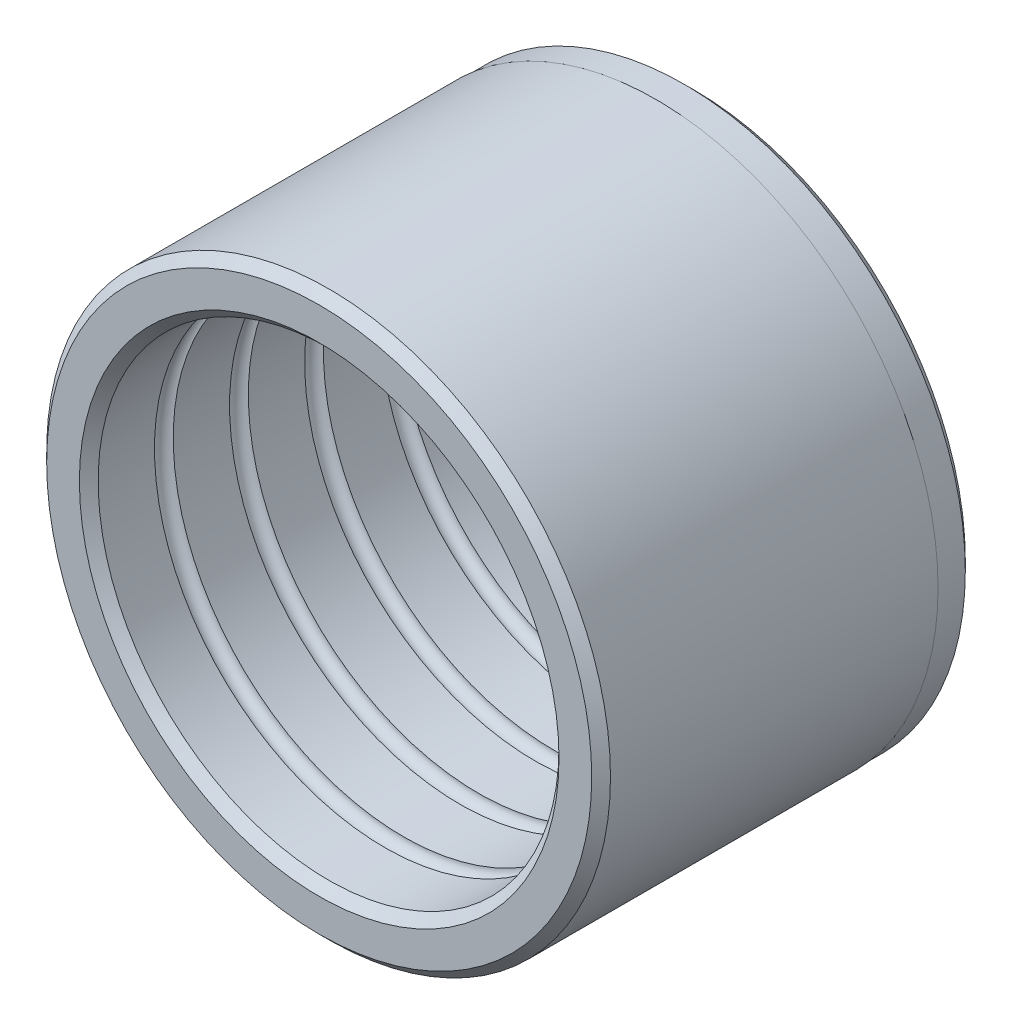
ISO-10303-21;
HEADER;
FILE_DESCRIPTION(('STEP AP214'),'2;1');
FILE_NAME('part.step','',(''),(''),'','','');
FILE_SCHEMA(('AUTOMOTIVE_DESIGN { 1 0 10303 214 1 1 1 1 }'));
ENDSEC;
DATA;
#1=APPLICATION_CONTEXT('core data for automotive mechanical design processes');
#2=APPLICATION_PROTOCOL_DEFINITION('international standard','automotive_design',2000,#1);
#3=PRODUCT_CONTEXT('',#1,'mechanical');
#4=PRODUCT('Part','Part','',(#3));
#5=PRODUCT_RELATED_PRODUCT_CATEGORY('part','',(#4));
#6=PRODUCT_DEFINITION_FORMATION('','',#4);
#7=PRODUCT_DEFINITION_CONTEXT('part definition',#1,'design');
#8=PRODUCT_DEFINITION('design','',#6,#7);
#9=PRODUCT_DEFINITION_SHAPE('','',#8);
#10=(LENGTH_UNIT() NAMED_UNIT(*) SI_UNIT(.MILLI.,.METRE.));
#11=(NAMED_UNIT(*) PLANE_ANGLE_UNIT() SI_UNIT($,.RADIAN.));
#12=(NAMED_UNIT(*) SI_UNIT($,.STERADIAN.) SOLID_ANGLE_UNIT());
#13=UNCERTAINTY_MEASURE_WITH_UNIT(LENGTH_MEASURE(1.E-05),#10,'distance_accuracy_value','');
#14=(GEOMETRIC_REPRESENTATION_CONTEXT(3) GLOBAL_UNCERTAINTY_ASSIGNED_CONTEXT((#13)) GLOBAL_UNIT_ASSIGNED_CONTEXT((#10,
#11,#12)) REPRESENTATION_CONTEXT('',''));
#15=CARTESIAN_POINT('',(0.,0.,0.));
#16=DIRECTION('',(0.,0.,1.));
#17=DIRECTION('',(1.,0.,0.));
#18=AXIS2_PLACEMENT_3D('',#15,#16,#17);
#19=CARTESIAN_POINT('',(0.,15.0175,-17.95));
#20=DIRECTION('',(0.,0.,1.));
#21=DIRECTION('',(1.,0.,0.));
#22=AXIS2_PLACEMENT_3D('',#19,#20,#21);
#23=PLANE('',#22);
#24=CARTESIAN_POINT('',(0.,0.,-17.95));
#25=DIRECTION('',(0.,0.,1.));
#26=DIRECTION('',(1.,0.,0.));
#27=AXIS2_PLACEMENT_3D('',#24,#25,#26);
#28=CIRCLE('',#27,15.0175);
#29=CARTESIAN_POINT('',(15.0175,0.,-17.95));
#30=VERTEX_POINT('',#29);
#31=EDGE_CURVE('E97',#30,#30,#28,.T.);
#32=ORIENTED_EDGE('',*,*,#31,.F.);
#33=EDGE_LOOP('',(#32));
#34=FACE_BOUND('',#33,.T.);
#35=CARTESIAN_POINT('',(0.,0.,-17.95));
#36=DIRECTION('',(0.,0.,1.));
#37=DIRECTION('',(1.,0.,0.));
#38=AXIS2_PLACEMENT_3D('',#35,#36,#37);
#39=CIRCLE('',#38,14.97);
#40=CARTESIAN_POINT('',(14.97,0.,-17.95));
#41=VERTEX_POINT('',#40);
#42=EDGE_CURVE('E10',#41,#41,#39,.T.);
#43=ORIENTED_EDGE('',*,*,#42,.T.);
#44=EDGE_LOOP('',(#43));
#45=FACE_BOUND('',#44,.T.);
#46=ADVANCED_FACE('F39',(#34,#45),#23,.F.);
#47=CARTESIAN_POINT('',(0.,0.,0.));
#48=DIRECTION('',(0.,0.,1.));
#49=DIRECTION('',(1.,0.,0.));
#50=AXIS2_PLACEMENT_3D('',#47,#48,#49);
#51=CYLINDRICAL_SURFACE('',#50,14.97);
#52=ORIENTED_EDGE('',*,*,#42,.F.);
#53=EDGE_LOOP('',(#52));
#54=FACE_BOUND('',#53,.T.);
#55=CARTESIAN_POINT('',(0.,0.,-19.45));
#56=DIRECTION('',(0.,0.,1.));
#57=DIRECTION('',(1.,0.,0.));
#58=AXIS2_PLACEMENT_3D('',#55,#56,#57);
#59=CIRCLE('',#58,14.97);
#60=CARTESIAN_POINT('',(14.97,0.,-19.45));
#61=VERTEX_POINT('',#60);
#62=EDGE_CURVE('E45',#61,#61,#59,.T.);
#63=ORIENTED_EDGE('',*,*,#62,.T.);
#64=EDGE_LOOP('',(#63));
#65=FACE_BOUND('',#64,.T.);
#66=ADVANCED_FACE('F104',(#54,#65),#51,.T.);
#67=CARTESIAN_POINT('',(0.,0.,-19.95));
#68=DIRECTION('',(0.,0.,1.));
#69=DIRECTION('',(1.,0.,0.));
#70=AXIS2_PLACEMENT_3D('',#67,#68,#69);
#71=CONICAL_SURFACE('',#70,14.47,0.785398163397448);
#72=ORIENTED_EDGE('',*,*,#62,.F.);
#73=EDGE_LOOP('',(#72));
#74=FACE_BOUND('',#73,.T.);
#75=CARTESIAN_POINT('',(0.,0.,-19.95));
#76=DIRECTION('',(0.,0.,1.));
#77=DIRECTION('',(1.,0.,0.));
#78=AXIS2_PLACEMENT_3D('',#75,#76,#77);
#79=CIRCLE('',#78,14.47);
#80=CARTESIAN_POINT('',(14.47,0.,-19.95));
#81=VERTEX_POINT('',#80);
#82=EDGE_CURVE('E49',#81,#81,#79,.T.);
#83=ORIENTED_EDGE('',*,*,#82,.T.);
#84=EDGE_LOOP('',(#83));
#85=FACE_BOUND('',#84,.T.);
#86=ADVANCED_FACE('F108',(#74,#85),#71,.T.);
#87=CARTESIAN_POINT('',(0.,14.47,-19.95));
#88=DIRECTION('',(0.,0.,1.));
#89=DIRECTION('',(1.,0.,0.));
#90=AXIS2_PLACEMENT_3D('',#87,#88,#89);
#91=PLANE('',#90);
#92=ORIENTED_EDGE('',*,*,#82,.F.);
#93=EDGE_LOOP('',(#92));
#94=FACE_BOUND('',#93,.T.);
#95=CARTESIAN_POINT('',(0.,0.,-19.95));
#96=DIRECTION('',(0.,0.,1.));
#97=DIRECTION('',(1.,0.,0.));
#98=AXIS2_PLACEMENT_3D('',#95,#96,#97);
#99=CIRCLE('',#98,12.775);
#100=CARTESIAN_POINT('',(12.775,0.,-19.95));
#101=VERTEX_POINT('',#100);
#102=EDGE_CURVE('E53',#101,#101,#99,.T.);
#103=ORIENTED_EDGE('',*,*,#102,.T.);
#104=EDGE_LOOP('',(#103));
#105=FACE_BOUND('',#104,.T.);
#106=ADVANCED_FACE('F113',(#94,#105),#91,.F.);
#107=CARTESIAN_POINT('',(0.,0.,-19.45));
#108=DIRECTION('',(0.,0.,-1.));
#109=DIRECTION('',(-1.,0.,0.));
#110=AXIS2_PLACEMENT_3D('',#107,#108,#109);
#111=CONICAL_SURFACE('',#110,12.275,0.785398163397448);
#112=ORIENTED_EDGE('',*,*,#102,.F.);
#113=EDGE_LOOP('',(#112));
#114=FACE_BOUND('',#113,.T.);
#115=CARTESIAN_POINT('',(0.,0.,-19.45));
#116=DIRECTION('',(0.,0.,1.));
#117=DIRECTION('',(1.,0.,0.));
#118=AXIS2_PLACEMENT_3D('',#115,#116,#117);
#119=CIRCLE('',#118,12.275);
#120=CARTESIAN_POINT('',(12.275,0.,-19.45));
#121=VERTEX_POINT('',#120);
#122=EDGE_CURVE('E58',#121,#121,#119,.T.);
#123=ORIENTED_EDGE('',*,*,#122,.T.);
#124=EDGE_LOOP('',(#123));
#125=FACE_BOUND('',#124,.T.);
#126=ADVANCED_FACE('F119',(#114,#125),#111,.F.);
#127=CARTESIAN_POINT('',(0.,0.,0.));
#128=DIRECTION('',(0.,0.,1.));
#129=DIRECTION('',(1.,0.,0.));
#130=AXIS2_PLACEMENT_3D('',#127,#128,#129);
#131=CYLINDRICAL_SURFACE('',#130,12.275);
#132=ORIENTED_EDGE('',*,*,#122,.F.);
#133=EDGE_LOOP('',(#132));
#134=FACE_BOUND('',#133,.T.);
#135=CARTESIAN_POINT('',(0.,0.,-16.5));
#136=DIRECTION('',(0.,0.,1.));
#137=DIRECTION('',(1.,0.,0.));
#138=AXIS2_PLACEMENT_3D('',#135,#136,#137);
#139=CIRCLE('',#138,12.275);
#140=CARTESIAN_POINT('',(12.275,0.,-16.5));
#141=VERTEX_POINT('',#140);
#142=EDGE_CURVE('E61',#141,#141,#139,.T.);
#143=ORIENTED_EDGE('',*,*,#142,.T.);
#144=EDGE_LOOP('',(#143));
#145=FACE_BOUND('',#144,.T.);
#146=ADVANCED_FACE('F123',(#134,#145),#131,.F.);
#147=CARTESIAN_POINT('',(0.,0.,-16.));
#148=DIRECTION('',(0.,0.,1.));
#149=DIRECTION('',(1.,0.,0.));
#150=AXIS2_PLACEMENT_3D('',#147,#148,#149);
#151=TOROIDAL_SURFACE('',#150,12.275,0.5);
#152=ORIENTED_EDGE('',*,*,#142,.F.);
#153=EDGE_LOOP('',(#152));
#154=FACE_BOUND('',#153,.T.);
#155=CARTESIAN_POINT('',(0.,0.,-15.5));
#156=DIRECTION('',(0.,0.,1.));
#157=DIRECTION('',(1.,0.,0.));
#158=AXIS2_PLACEMENT_3D('',#155,#156,#157);
#159=CIRCLE('',#158,12.275);
#160=CARTESIAN_POINT('',(12.275,0.,-15.5));
#161=VERTEX_POINT('',#160);
#162=EDGE_CURVE('E64',#161,#161,#159,.T.);
#163=ORIENTED_EDGE('',*,*,#162,.T.);
#164=EDGE_LOOP('',(#163));
#165=FACE_BOUND('',#164,.T.);
#166=ADVANCED_FACE('F127',(#154,#165),#151,.F.);
#167=CARTESIAN_POINT('',(0.,0.,0.));
#168=DIRECTION('',(0.,0.,1.));
#169=DIRECTION('',(1.,0.,0.));
#170=AXIS2_PLACEMENT_3D('',#167,#168,#169);
#171=CYLINDRICAL_SURFACE('',#170,12.275);
#172=ORIENTED_EDGE('',*,*,#162,.F.);
#173=EDGE_LOOP('',(#172));
#174=FACE_BOUND('',#173,.T.);
#175=CARTESIAN_POINT('',(0.,0.,-12.5));
#176=DIRECTION('',(0.,0.,1.));
#177=DIRECTION('',(1.,0.,0.));
#178=AXIS2_PLACEMENT_3D('',#175,#176,#177);
#179=CIRCLE('',#178,12.275);
#180=CARTESIAN_POINT('',(12.275,0.,-12.5));
#181=VERTEX_POINT('',#180);
#182=EDGE_CURVE('E67',#181,#181,#179,.T.);
#183=ORIENTED_EDGE('',*,*,#182,.T.);
#184=EDGE_LOOP('',(#183));
#185=FACE_BOUND('',#184,.T.);
#186=ADVANCED_FACE('F131',(#174,#185),#171,.F.);
#187=CARTESIAN_POINT('',(0.,0.,-12.));
#188=DIRECTION('',(0.,0.,1.));
#189=DIRECTION('',(1.,0.,0.));
#190=AXIS2_PLACEMENT_3D('',#187,#188,#189);
#191=TOROIDAL_SURFACE('',#190,12.275,0.5);
#192=ORIENTED_EDGE('',*,*,#182,.F.);
#193=EDGE_LOOP('',(#192));
#194=FACE_BOUND('',#193,.T.);
#195=CARTESIAN_POINT('',(0.,0.,-11.5));
#196=DIRECTION('',(0.,0.,1.));
#197=DIRECTION('',(1.,0.,0.));
#198=AXIS2_PLACEMENT_3D('',#195,#196,#197);
#199=CIRCLE('',#198,12.275);
#200=CARTESIAN_POINT('',(12.275,0.,-11.5));
#201=VERTEX_POINT('',#200);
#202=EDGE_CURVE('E70',#201,#201,#199,.T.);
#203=ORIENTED_EDGE('',*,*,#202,.T.);
#204=EDGE_LOOP('',(#203));
#205=FACE_BOUND('',#204,.T.);
#206=ADVANCED_FACE('F135',(#194,#205),#191,.F.);
#207=CARTESIAN_POINT('',(0.,0.,0.));
#208=DIRECTION('',(0.,0.,1.));
#209=DIRECTION('',(1.,0.,0.));
#210=AXIS2_PLACEMENT_3D('',#207,#208,#209);
#211=CYLINDRICAL_SURFACE('',#210,12.275);
#212=ORIENTED_EDGE('',*,*,#202,.F.);
#213=EDGE_LOOP('',(#212));
#214=FACE_BOUND('',#213,.T.);
#215=CARTESIAN_POINT('',(0.,0.,-8.5));
#216=DIRECTION('',(0.,0.,1.));
#217=DIRECTION('',(1.,0.,0.));
#218=AXIS2_PLACEMENT_3D('',#215,#216,#217);
#219=CIRCLE('',#218,12.275);
#220=CARTESIAN_POINT('',(12.275,0.,-8.5));
#221=VERTEX_POINT('',#220);
#222=EDGE_CURVE('E73',#221,#221,#219,.T.);
#223=ORIENTED_EDGE('',*,*,#222,.T.);
#224=EDGE_LOOP('',(#223));
#225=FACE_BOUND('',#224,.T.);
#226=ADVANCED_FACE('F139',(#214,#225),#211,.F.);
#227=CARTESIAN_POINT('',(0.,0.,-8.));
#228=DIRECTION('',(0.,0.,1.));
#229=DIRECTION('',(1.,0.,0.));
#230=AXIS2_PLACEMENT_3D('',#227,#228,#229);
#231=TOROIDAL_SURFACE('',#230,12.275,0.5);
#232=ORIENTED_EDGE('',*,*,#222,.F.);
#233=EDGE_LOOP('',(#232));
#234=FACE_BOUND('',#233,.T.);
#235=CARTESIAN_POINT('',(0.,0.,-7.5));
#236=DIRECTION('',(0.,0.,1.));
#237=DIRECTION('',(1.,0.,0.));
#238=AXIS2_PLACEMENT_3D('',#235,#236,#237);
#239=CIRCLE('',#238,12.275);
#240=CARTESIAN_POINT('',(12.275,0.,-7.5));
#241=VERTEX_POINT('',#240);
#242=EDGE_CURVE('E76',#241,#241,#239,.T.);
#243=ORIENTED_EDGE('',*,*,#242,.T.);
#244=EDGE_LOOP('',(#243));
#245=FACE_BOUND('',#244,.T.);
#246=ADVANCED_FACE('F143',(#234,#245),#231,.F.);
#247=CARTESIAN_POINT('',(0.,0.,0.));
#248=DIRECTION('',(0.,0.,1.));
#249=DIRECTION('',(1.,0.,0.));
#250=AXIS2_PLACEMENT_3D('',#247,#248,#249);
#251=CYLINDRICAL_SURFACE('',#250,12.275);
#252=ORIENTED_EDGE('',*,*,#242,.F.);
#253=EDGE_LOOP('',(#252));
#254=FACE_BOUND('',#253,.T.);
#255=CARTESIAN_POINT('',(0.,0.,-4.5));
#256=DIRECTION('',(0.,0.,1.));
#257=DIRECTION('',(1.,0.,0.));
#258=AXIS2_PLACEMENT_3D('',#255,#256,#257);
#259=CIRCLE('',#258,12.275);
#260=CARTESIAN_POINT('',(12.275,0.,-4.5));
#261=VERTEX_POINT('',#260);
#262=EDGE_CURVE('E79',#261,#261,#259,.T.);
#263=ORIENTED_EDGE('',*,*,#262,.T.);
#264=EDGE_LOOP('',(#263));
#265=FACE_BOUND('',#264,.T.);
#266=ADVANCED_FACE('F147',(#254,#265),#251,.F.);
#267=CARTESIAN_POINT('',(0.,0.,-3.99999999999999));
#268=DIRECTION('',(0.,0.,1.));
#269=DIRECTION('',(1.,0.,0.));
#270=AXIS2_PLACEMENT_3D('',#267,#268,#269);
#271=TOROIDAL_SURFACE('',#270,12.275,0.500000000000002);
#272=ORIENTED_EDGE('',*,*,#262,.F.);
#273=EDGE_LOOP('',(#272));
#274=FACE_BOUND('',#273,.T.);
#275=CARTESIAN_POINT('',(0.,0.,-3.49999999999999));
#276=DIRECTION('',(0.,0.,1.));
#277=DIRECTION('',(1.,0.,0.));
#278=AXIS2_PLACEMENT_3D('',#275,#276,#277);
#279=CIRCLE('',#278,12.275);
#280=CARTESIAN_POINT('',(12.275,0.,-3.49999999999999));
#281=VERTEX_POINT('',#280);
#282=EDGE_CURVE('E82',#281,#281,#279,.T.);
#283=ORIENTED_EDGE('',*,*,#282,.T.);
#284=EDGE_LOOP('',(#283));
#285=FACE_BOUND('',#284,.T.);
#286=ADVANCED_FACE('F151',(#274,#285),#271,.F.);
#287=CARTESIAN_POINT('',(0.,0.,0.));
#288=DIRECTION('',(0.,0.,1.));
#289=DIRECTION('',(1.,0.,0.));
#290=AXIS2_PLACEMENT_3D('',#287,#288,#289);
#291=CYLINDRICAL_SURFACE('',#290,12.275);
#292=ORIENTED_EDGE('',*,*,#282,.F.);
#293=EDGE_LOOP('',(#292));
#294=FACE_BOUND('',#293,.T.);
#295=CARTESIAN_POINT('',(0.,0.,-0.499999999999999));
#296=DIRECTION('',(0.,0.,1.));
#297=DIRECTION('',(1.,0.,0.));
#298=AXIS2_PLACEMENT_3D('',#295,#296,#297);
#299=CIRCLE('',#298,12.275);
#300=CARTESIAN_POINT('',(12.275,0.,-0.499999999999999));
#301=VERTEX_POINT('',#300);
#302=EDGE_CURVE('E85',#301,#301,#299,.T.);
#303=ORIENTED_EDGE('',*,*,#302,.T.);
#304=EDGE_LOOP('',(#303));
#305=FACE_BOUND('',#304,.T.);
#306=ADVANCED_FACE('F155',(#294,#305),#291,.F.);
#307=CARTESIAN_POINT('',(0.,0.,0.));
#308=DIRECTION('',(0.,0.,1.));
#309=DIRECTION('',(1.,0.,0.));
#310=AXIS2_PLACEMENT_3D('',#307,#308,#309);
#311=CONICAL_SURFACE('',#310,12.775,0.785398163397449);
#312=ORIENTED_EDGE('',*,*,#302,.F.);
#313=EDGE_LOOP('',(#312));
#314=FACE_BOUND('',#313,.T.);
#315=CARTESIAN_POINT('',(0.,0.,0.));
#316=DIRECTION('',(0.,0.,1.));
#317=DIRECTION('',(1.,0.,0.));
#318=AXIS2_PLACEMENT_3D('',#315,#316,#317);
#319=CIRCLE('',#318,12.775);
#320=CARTESIAN_POINT('',(12.775,0.,0.));
#321=VERTEX_POINT('',#320);
#322=EDGE_CURVE('E88',#321,#321,#319,.T.);
#323=ORIENTED_EDGE('',*,*,#322,.T.);
#324=EDGE_LOOP('',(#323));
#325=FACE_BOUND('',#324,.T.);
#326=ADVANCED_FACE('F159',(#314,#325),#311,.F.);
#327=CARTESIAN_POINT('',(0.,14.5175,0.));
#328=DIRECTION('',(0.,0.,-1.));
#329=DIRECTION('',(-1.,0.,0.));
#330=AXIS2_PLACEMENT_3D('',#327,#328,#329);
#331=PLANE('',#330);
#332=ORIENTED_EDGE('',*,*,#322,.F.);
#333=EDGE_LOOP('',(#332));
#334=FACE_BOUND('',#333,.T.);
#335=CARTESIAN_POINT('',(0.,0.,0.));
#336=DIRECTION('',(0.,0.,1.));
#337=DIRECTION('',(1.,0.,0.));
#338=AXIS2_PLACEMENT_3D('',#335,#336,#337);
#339=CIRCLE('',#338,14.5175);
#340=CARTESIAN_POINT('',(14.5175,0.,0.));
#341=VERTEX_POINT('',#340);
#342=EDGE_CURVE('E91',#341,#341,#339,.T.);
#343=ORIENTED_EDGE('',*,*,#342,.T.);
#344=EDGE_LOOP('',(#343));
#345=FACE_BOUND('',#344,.T.);
#346=ADVANCED_FACE('F163',(#334,#345),#331,.F.);
#347=CARTESIAN_POINT('',(0.,0.,-0.5));
#348=DIRECTION('',(0.,0.,-1.));
#349=DIRECTION('',(-1.,0.,0.));
#350=AXIS2_PLACEMENT_3D('',#347,#348,#349);
#351=CONICAL_SURFACE('',#350,15.0175,0.785398163397449);
#352=ORIENTED_EDGE('',*,*,#342,.F.);
#353=EDGE_LOOP('',(#352));
#354=FACE_BOUND('',#353,.T.);
#355=CARTESIAN_POINT('',(0.,0.,-0.5));
#356=DIRECTION('',(0.,0.,1.));
#357=DIRECTION('',(1.,0.,0.));
#358=AXIS2_PLACEMENT_3D('',#355,#356,#357);
#359=CIRCLE('',#358,15.0175);
#360=CARTESIAN_POINT('',(15.0175,0.,-0.5));
#361=VERTEX_POINT('',#360);
#362=EDGE_CURVE('E94',#361,#361,#359,.T.);
#363=ORIENTED_EDGE('',*,*,#362,.T.);
#364=EDGE_LOOP('',(#363));
#365=FACE_BOUND('',#364,.T.);
#366=ADVANCED_FACE('F167',(#354,#365),#351,.T.);
#367=CARTESIAN_POINT('',(0.,0.,0.));
#368=DIRECTION('',(0.,0.,1.));
#369=DIRECTION('',(1.,0.,0.));
#370=AXIS2_PLACEMENT_3D('',#367,#368,#369);
#371=CYLINDRICAL_SURFACE('',#370,15.0175);
#372=ORIENTED_EDGE('',*,*,#362,.F.);
#373=EDGE_LOOP('',(#372));
#374=FACE_BOUND('',#373,.T.);
#375=ORIENTED_EDGE('',*,*,#31,.T.);
#376=EDGE_LOOP('',(#375));
#377=FACE_BOUND('',#376,.T.);
#378=ADVANCED_FACE('F101',(#374,#377),#371,.T.);
#379=CLOSED_SHELL('',(#46,#66,#86,#106,#126,#146,#166,#186,#206,#226,#246,#266,#286,#306,#326,
#346,#366,#378));
#380=MANIFOLD_SOLID_BREP('B2',#379);
#381=ADVANCED_BREP_SHAPE_REPRESENTATION('',(#18,#380),#14);
#382=SHAPE_DEFINITION_REPRESENTATION(#9,#381);
ENDSEC;
END-ISO-10303-21;
